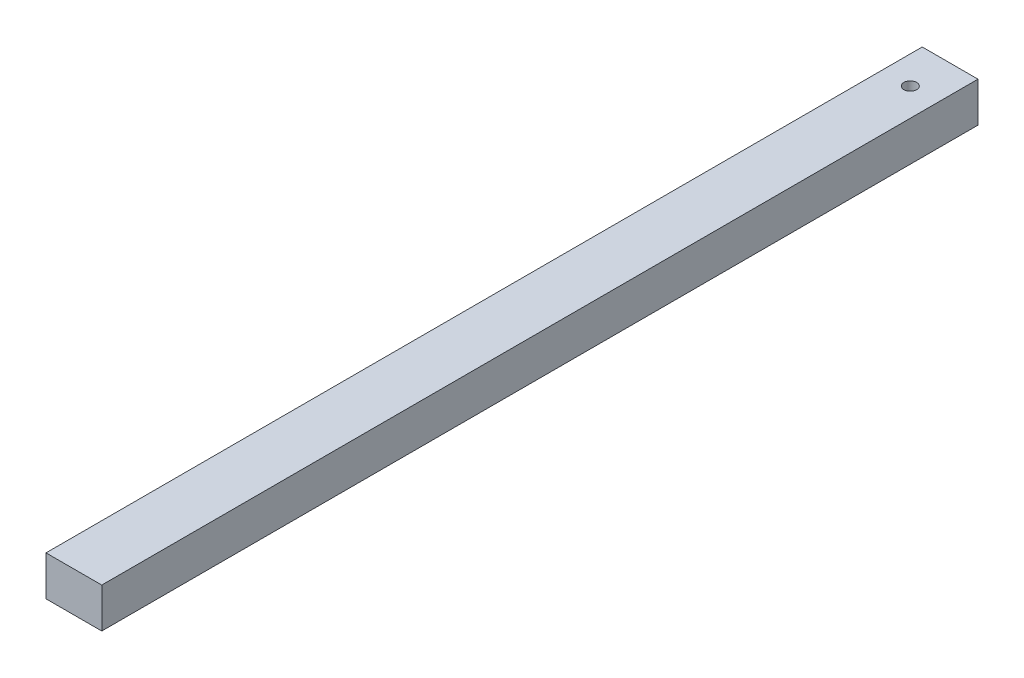
ISO-10303-21;
HEADER;
FILE_DESCRIPTION(('STEP AP214'),'2;1');
FILE_NAME('part.step','',(''),(''),'','','');
FILE_SCHEMA(('AUTOMOTIVE_DESIGN { 1 0 10303 214 1 1 1 1 }'));
ENDSEC;
DATA;
#1=APPLICATION_CONTEXT('core data for automotive mechanical design processes');
#2=APPLICATION_PROTOCOL_DEFINITION('international standard','automotive_design',2000,#1);
#3=PRODUCT_CONTEXT('',#1,'mechanical');
#4=PRODUCT('Part','Part','',(#3));
#5=PRODUCT_RELATED_PRODUCT_CATEGORY('part','',(#4));
#6=PRODUCT_DEFINITION_FORMATION('','',#4);
#7=PRODUCT_DEFINITION_CONTEXT('part definition',#1,'design');
#8=PRODUCT_DEFINITION('design','',#6,#7);
#9=PRODUCT_DEFINITION_SHAPE('','',#8);
#10=(LENGTH_UNIT() NAMED_UNIT(*) SI_UNIT(.MILLI.,.METRE.));
#11=(NAMED_UNIT(*) PLANE_ANGLE_UNIT() SI_UNIT($,.RADIAN.));
#12=(NAMED_UNIT(*) SI_UNIT($,.STERADIAN.) SOLID_ANGLE_UNIT());
#13=UNCERTAINTY_MEASURE_WITH_UNIT(LENGTH_MEASURE(1.E-05),#10,'distance_accuracy_value','');
#14=(GEOMETRIC_REPRESENTATION_CONTEXT(3) GLOBAL_UNCERTAINTY_ASSIGNED_CONTEXT((#13)) GLOBAL_UNIT_ASSIGNED_CONTEXT((#10,
#11,#12)) REPRESENTATION_CONTEXT('',''));
#15=CARTESIAN_POINT('',(0.,0.,0.));
#16=DIRECTION('',(0.,0.,1.));
#17=DIRECTION('',(1.,0.,0.));
#18=AXIS2_PLACEMENT_3D('',#15,#16,#17);
#19=CARTESIAN_POINT('',(17.5,12.5,550.));
#20=DIRECTION('',(-1.,0.,0.));
#21=DIRECTION('',(0.,-1.,0.));
#22=AXIS2_PLACEMENT_3D('',#19,#20,#21);
#23=PLANE('',#22);
#24=DIRECTION('',(0.,1.,0.));
#25=VECTOR('',#24,1.);
#26=CARTESIAN_POINT('',(17.5,12.5,0.));
#27=LINE('',#26,#25);
#28=CARTESIAN_POINT('',(17.5,-12.5,0.));
#29=VERTEX_POINT('',#28);
#30=CARTESIAN_POINT('',(17.5,12.5,0.));
#31=VERTEX_POINT('',#30);
#32=EDGE_CURVE('E98',#29,#31,#27,.T.);
#33=ORIENTED_EDGE('',*,*,#32,.T.);
#34=DIRECTION('',(0.,0.,-1.));
#35=VECTOR('',#34,1.);
#36=CARTESIAN_POINT('',(17.5,12.5,550.));
#37=LINE('',#36,#35);
#38=CARTESIAN_POINT('',(17.5,12.5,550.));
#39=VERTEX_POINT('',#38);
#40=EDGE_CURVE('E11',#39,#31,#37,.T.);
#41=ORIENTED_EDGE('',*,*,#40,.F.);
#42=DIRECTION('',(0.,1.,0.));
#43=VECTOR('',#42,1.);
#44=CARTESIAN_POINT('',(17.5,12.5,550.));
#45=LINE('',#44,#43);
#46=CARTESIAN_POINT('',(17.5,-12.5,550.));
#47=VERTEX_POINT('',#46);
#48=EDGE_CURVE('E86',#47,#39,#45,.T.);
#49=ORIENTED_EDGE('',*,*,#48,.F.);
#50=DIRECTION('',(0.,0.,-1.));
#51=VECTOR('',#50,1.);
#52=CARTESIAN_POINT('',(17.5,-12.5,550.));
#53=LINE('',#52,#51);
#54=EDGE_CURVE('E94',#47,#29,#53,.T.);
#55=ORIENTED_EDGE('',*,*,#54,.T.);
#56=EDGE_LOOP('',(#33,#41,#49,#55));
#57=FACE_BOUND('',#56,.T.);
#58=ADVANCED_FACE('F35',(#57),#23,.F.);
#59=CARTESIAN_POINT('',(-17.5,12.5,550.));
#60=DIRECTION('',(0.,-1.,0.));
#61=DIRECTION('',(0.,0.,-1.));
#62=AXIS2_PLACEMENT_3D('',#59,#60,#61);
#63=PLANE('',#62);
#64=CARTESIAN_POINT('',(0.,12.5,25.));
#65=DIRECTION('',(0.,1.,0.));
#66=DIRECTION('',(0.,0.,1.));
#67=AXIS2_PLACEMENT_3D('',#64,#65,#66);
#68=CIRCLE('',#67,4.);
#69=CARTESIAN_POINT('',(0.,12.5,29.));
#70=VERTEX_POINT('',#69);
#71=EDGE_CURVE('E112',#70,#70,#68,.T.);
#72=ORIENTED_EDGE('',*,*,#71,.F.);
#73=EDGE_LOOP('',(#72));
#74=FACE_BOUND('',#73,.T.);
#75=DIRECTION('',(-1.,0.,0.));
#76=VECTOR('',#75,1.);
#77=CARTESIAN_POINT('',(-17.5,12.5,0.));
#78=LINE('',#77,#76);
#79=CARTESIAN_POINT('',(-17.5,12.5,0.));
#80=VERTEX_POINT('',#79);
#81=EDGE_CURVE('E90',#31,#80,#78,.T.);
#82=ORIENTED_EDGE('',*,*,#81,.T.);
#83=DIRECTION('',(0.,0.,-1.));
#84=VECTOR('',#83,1.);
#85=CARTESIAN_POINT('',(-17.5,12.5,550.));
#86=LINE('',#85,#84);
#87=CARTESIAN_POINT('',(-17.5,12.5,550.));
#88=VERTEX_POINT('',#87);
#89=EDGE_CURVE('E43',#88,#80,#86,.T.);
#90=ORIENTED_EDGE('',*,*,#89,.F.);
#91=DIRECTION('',(-1.,0.,0.));
#92=VECTOR('',#91,1.);
#93=CARTESIAN_POINT('',(-17.5,12.5,550.));
#94=LINE('',#93,#92);
#95=EDGE_CURVE('E81',#39,#88,#94,.T.);
#96=ORIENTED_EDGE('',*,*,#95,.F.);
#97=ORIENTED_EDGE('',*,*,#40,.T.);
#98=EDGE_LOOP('',(#82,#90,#96,#97));
#99=FACE_BOUND('',#98,.T.);
#100=ADVANCED_FACE('F89',(#74,#99),#63,.F.);
#101=CARTESIAN_POINT('',(-17.5,12.5,550.));
#102=DIRECTION('',(1.,0.,0.));
#103=DIRECTION('',(0.,1.,0.));
#104=AXIS2_PLACEMENT_3D('',#101,#102,#103);
#105=PLANE('',#104);
#106=DIRECTION('',(0.,-1.,0.));
#107=VECTOR('',#106,1.);
#108=CARTESIAN_POINT('',(-17.5,12.5,0.));
#109=LINE('',#108,#107);
#110=CARTESIAN_POINT('',(-17.5,-12.5,0.));
#111=VERTEX_POINT('',#110);
#112=EDGE_CURVE('E68',#80,#111,#109,.T.);
#113=ORIENTED_EDGE('',*,*,#112,.T.);
#114=DIRECTION('',(0.,0.,-1.));
#115=VECTOR('',#114,1.);
#116=CARTESIAN_POINT('',(-17.5,-12.5,550.));
#117=LINE('',#116,#115);
#118=CARTESIAN_POINT('',(-17.5,-12.5,550.));
#119=VERTEX_POINT('',#118);
#120=EDGE_CURVE('E91',#119,#111,#117,.T.);
#121=ORIENTED_EDGE('',*,*,#120,.F.);
#122=DIRECTION('',(0.,-1.,0.));
#123=VECTOR('',#122,1.);
#124=CARTESIAN_POINT('',(-17.5,12.5,550.));
#125=LINE('',#124,#123);
#126=EDGE_CURVE('E84',#88,#119,#125,.T.);
#127=ORIENTED_EDGE('',*,*,#126,.F.);
#128=ORIENTED_EDGE('',*,*,#89,.T.);
#129=EDGE_LOOP('',(#113,#121,#127,#128));
#130=FACE_BOUND('',#129,.T.);
#131=ADVANCED_FACE('F92',(#130),#105,.F.);
#132=CARTESIAN_POINT('',(-17.5,-12.5,550.));
#133=DIRECTION('',(0.,1.,0.));
#134=DIRECTION('',(0.,0.,1.));
#135=AXIS2_PLACEMENT_3D('',#132,#133,#134);
#136=PLANE('',#135);
#137=CARTESIAN_POINT('',(0.,-12.5,25.));
#138=DIRECTION('',(0.,1.,0.));
#139=DIRECTION('',(0.,0.,1.));
#140=AXIS2_PLACEMENT_3D('',#137,#138,#139);
#141=CIRCLE('',#140,4.);
#142=CARTESIAN_POINT('',(0.,-12.5,29.));
#143=VERTEX_POINT('',#142);
#144=EDGE_CURVE('E101',#143,#143,#141,.T.);
#145=ORIENTED_EDGE('',*,*,#144,.T.);
#146=EDGE_LOOP('',(#145));
#147=FACE_BOUND('',#146,.T.);
#148=DIRECTION('',(1.,0.,0.));
#149=VECTOR('',#148,1.);
#150=CARTESIAN_POINT('',(-17.5,-12.5,0.));
#151=LINE('',#150,#149);
#152=EDGE_CURVE('E74',#111,#29,#151,.T.);
#153=ORIENTED_EDGE('',*,*,#152,.T.);
#154=ORIENTED_EDGE('',*,*,#54,.F.);
#155=DIRECTION('',(1.,0.,0.));
#156=VECTOR('',#155,1.);
#157=CARTESIAN_POINT('',(-17.5,-12.5,550.));
#158=LINE('',#157,#156);
#159=EDGE_CURVE('E51',#119,#47,#158,.T.);
#160=ORIENTED_EDGE('',*,*,#159,.F.);
#161=ORIENTED_EDGE('',*,*,#120,.T.);
#162=EDGE_LOOP('',(#153,#154,#160,#161));
#163=FACE_BOUND('',#162,.T.);
#164=ADVANCED_FACE('F106',(#147,#163),#136,.F.);
#165=CARTESIAN_POINT('',(0.,0.,550.));
#166=DIRECTION('',(0.,0.,1.));
#167=DIRECTION('',(1.,0.,0.));
#168=AXIS2_PLACEMENT_3D('',#165,#166,#167);
#169=PLANE('',#168);
#170=ORIENTED_EDGE('',*,*,#48,.T.);
#171=ORIENTED_EDGE('',*,*,#95,.T.);
#172=ORIENTED_EDGE('',*,*,#126,.T.);
#173=ORIENTED_EDGE('',*,*,#159,.T.);
#174=EDGE_LOOP('',(#170,#171,#172,#173));
#175=FACE_BOUND('',#174,.T.);
#176=ADVANCED_FACE('F82',(#175),#169,.T.);
#177=CARTESIAN_POINT('',(0.,0.,0.));
#178=DIRECTION('',(0.,0.,1.));
#179=DIRECTION('',(1.,0.,0.));
#180=AXIS2_PLACEMENT_3D('',#177,#178,#179);
#181=PLANE('',#180);
#182=ORIENTED_EDGE('',*,*,#32,.F.);
#183=ORIENTED_EDGE('',*,*,#152,.F.);
#184=ORIENTED_EDGE('',*,*,#112,.F.);
#185=ORIENTED_EDGE('',*,*,#81,.F.);
#186=EDGE_LOOP('',(#182,#183,#184,#185));
#187=FACE_BOUND('',#186,.T.);
#188=ADVANCED_FACE('F109',(#187),#181,.F.);
#189=CARTESIAN_POINT('',(0.,-12.5,25.));
#190=DIRECTION('',(0.,1.,0.));
#191=DIRECTION('',(0.,0.,1.));
#192=AXIS2_PLACEMENT_3D('',#189,#190,#191);
#193=CYLINDRICAL_SURFACE('',#192,4.);
#194=ORIENTED_EDGE('',*,*,#144,.F.);
#195=EDGE_LOOP('',(#194));
#196=FACE_BOUND('',#195,.T.);
#197=ORIENTED_EDGE('',*,*,#71,.T.);
#198=EDGE_LOOP('',(#197));
#199=FACE_BOUND('',#198,.T.);
#200=ADVANCED_FACE('F119',(#196,#199),#193,.F.);
#201=CLOSED_SHELL('',(#58,#100,#131,#164,#176,#188,#200));
#202=MANIFOLD_SOLID_BREP('B2',#201);
#203=ADVANCED_BREP_SHAPE_REPRESENTATION('',(#18,#202),#14);
#204=SHAPE_DEFINITION_REPRESENTATION(#9,#203);
ENDSEC;
END-ISO-10303-21;
